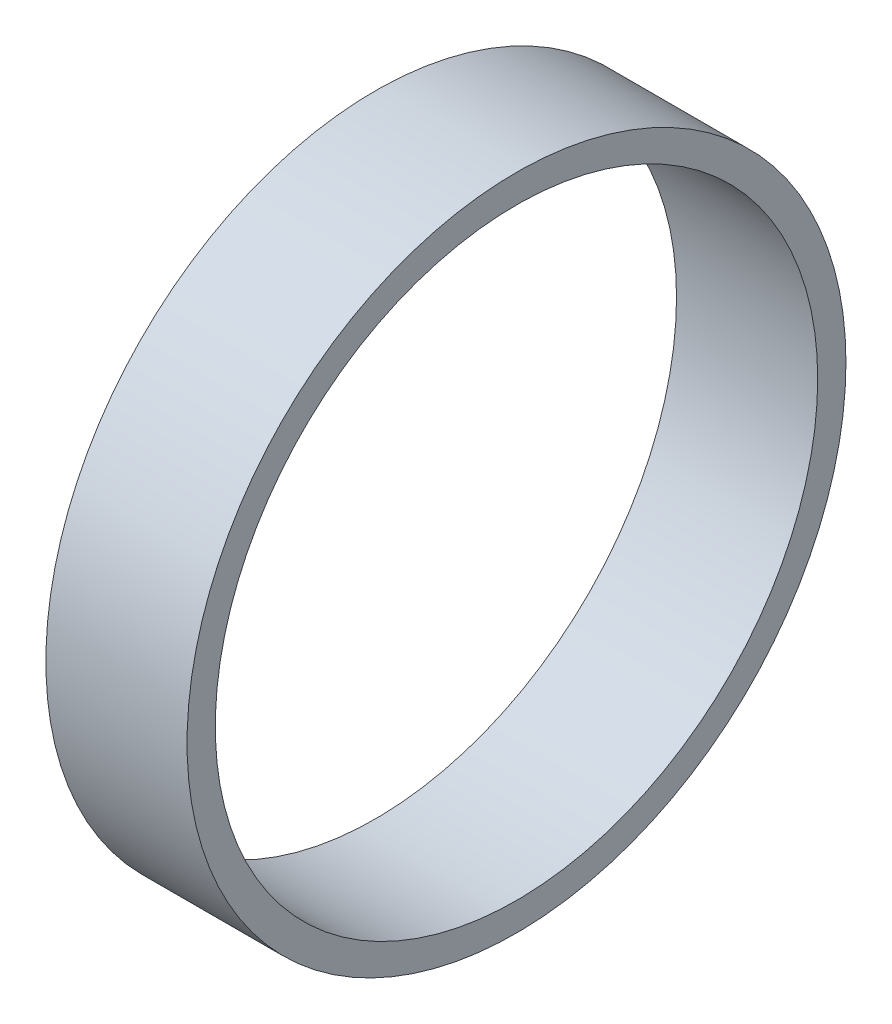
ISO-10303-21;
HEADER;
FILE_DESCRIPTION(('STEP AP214'),'2;1');
FILE_NAME('part.step','',(''),(''),'','','');
FILE_SCHEMA(('AUTOMOTIVE_DESIGN { 1 0 10303 214 1 1 1 1 }'));
ENDSEC;
DATA;
#1=APPLICATION_CONTEXT('core data for automotive mechanical design processes');
#2=APPLICATION_PROTOCOL_DEFINITION('international standard','automotive_design',2000,#1);
#3=PRODUCT_CONTEXT('',#1,'mechanical');
#4=PRODUCT('Part','Part','',(#3));
#5=PRODUCT_RELATED_PRODUCT_CATEGORY('part','',(#4));
#6=PRODUCT_DEFINITION_FORMATION('','',#4);
#7=PRODUCT_DEFINITION_CONTEXT('part definition',#1,'design');
#8=PRODUCT_DEFINITION('design','',#6,#7);
#9=PRODUCT_DEFINITION_SHAPE('','',#8);
#10=(LENGTH_UNIT() NAMED_UNIT(*) SI_UNIT(.MILLI.,.METRE.));
#11=(NAMED_UNIT(*) PLANE_ANGLE_UNIT() SI_UNIT($,.RADIAN.));
#12=(NAMED_UNIT(*) SI_UNIT($,.STERADIAN.) SOLID_ANGLE_UNIT());
#13=UNCERTAINTY_MEASURE_WITH_UNIT(LENGTH_MEASURE(1.E-05),#10,'distance_accuracy_value','');
#14=(GEOMETRIC_REPRESENTATION_CONTEXT(3) GLOBAL_UNCERTAINTY_ASSIGNED_CONTEXT((#13)) GLOBAL_UNIT_ASSIGNED_CONTEXT((#10,
#11,#12)) REPRESENTATION_CONTEXT('',''));
#15=CARTESIAN_POINT('',(0.,0.,0.));
#16=DIRECTION('',(0.,0.,1.));
#17=DIRECTION('',(1.,0.,0.));
#18=AXIS2_PLACEMENT_3D('',#15,#16,#17);
#19=CARTESIAN_POINT('',(15.,0.,0.));
#20=DIRECTION('',(1.,0.,0.));
#21=DIRECTION('',(0.,0.,-1.));
#22=AXIS2_PLACEMENT_3D('',#19,#20,#21);
#23=PLANE('',#22);
#24=CARTESIAN_POINT('',(15.,0.,0.));
#25=DIRECTION('',(1.,0.,0.));
#26=DIRECTION('',(0.,0.,-1.));
#27=AXIS2_PLACEMENT_3D('',#24,#25,#26);
#28=CIRCLE('',#27,35.);
#29=CARTESIAN_POINT('',(15.,0.,-35.));
#30=VERTEX_POINT('',#29);
#31=EDGE_CURVE('E10',#30,#30,#28,.T.);
#32=ORIENTED_EDGE('',*,*,#31,.T.);
#33=EDGE_LOOP('',(#32));
#34=FACE_BOUND('',#33,.T.);
#35=CARTESIAN_POINT('',(15.,0.,0.));
#36=DIRECTION('',(1.,0.,0.));
#37=DIRECTION('',(0.,0.,-1.));
#38=AXIS2_PLACEMENT_3D('',#35,#36,#37);
#39=CIRCLE('',#38,32.);
#40=CARTESIAN_POINT('',(15.,0.,-32.));
#41=VERTEX_POINT('',#40);
#42=EDGE_CURVE('E48',#41,#41,#39,.T.);
#43=ORIENTED_EDGE('',*,*,#42,.F.);
#44=EDGE_LOOP('',(#43));
#45=FACE_BOUND('',#44,.T.);
#46=ADVANCED_FACE('F37',(#34,#45),#23,.T.);
#47=CARTESIAN_POINT('',(0.,0.,0.));
#48=DIRECTION('',(1.,0.,0.));
#49=DIRECTION('',(0.,0.,-1.));
#50=AXIS2_PLACEMENT_3D('',#47,#48,#49);
#51=PLANE('',#50);
#52=CARTESIAN_POINT('',(0.,0.,0.));
#53=DIRECTION('',(1.,0.,0.));
#54=DIRECTION('',(0.,0.,-1.));
#55=AXIS2_PLACEMENT_3D('',#52,#53,#54);
#56=CIRCLE('',#55,35.);
#57=CARTESIAN_POINT('',(0.,0.,-35.));
#58=VERTEX_POINT('',#57);
#59=EDGE_CURVE('E41',#58,#58,#56,.T.);
#60=ORIENTED_EDGE('',*,*,#59,.F.);
#61=EDGE_LOOP('',(#60));
#62=FACE_BOUND('',#61,.T.);
#63=CARTESIAN_POINT('',(0.,0.,0.));
#64=DIRECTION('',(1.,0.,0.));
#65=DIRECTION('',(0.,0.,-1.));
#66=AXIS2_PLACEMENT_3D('',#63,#64,#65);
#67=CIRCLE('',#66,32.);
#68=CARTESIAN_POINT('',(0.,0.,-32.));
#69=VERTEX_POINT('',#68);
#70=EDGE_CURVE('E50',#69,#69,#67,.T.);
#71=ORIENTED_EDGE('',*,*,#70,.T.);
#72=EDGE_LOOP('',(#71));
#73=FACE_BOUND('',#72,.T.);
#74=ADVANCED_FACE('F60',(#62,#73),#51,.F.);
#75=CARTESIAN_POINT('',(15.,0.,0.));
#76=DIRECTION('',(-1.,0.,0.));
#77=DIRECTION('',(0.,0.,1.));
#78=AXIS2_PLACEMENT_3D('',#75,#76,#77);
#79=CYLINDRICAL_SURFACE('',#78,35.);
#80=ORIENTED_EDGE('',*,*,#31,.F.);
#81=EDGE_LOOP('',(#80));
#82=FACE_BOUND('',#81,.T.);
#83=ORIENTED_EDGE('',*,*,#59,.T.);
#84=EDGE_LOOP('',(#83));
#85=FACE_BOUND('',#84,.T.);
#86=ADVANCED_FACE('F39',(#82,#85),#79,.T.);
#87=CARTESIAN_POINT('',(15.,0.,0.));
#88=DIRECTION('',(-1.,0.,0.));
#89=DIRECTION('',(0.,0.,1.));
#90=AXIS2_PLACEMENT_3D('',#87,#88,#89);
#91=CYLINDRICAL_SURFACE('',#90,32.);
#92=ORIENTED_EDGE('',*,*,#42,.T.);
#93=EDGE_LOOP('',(#92));
#94=FACE_BOUND('',#93,.T.);
#95=ORIENTED_EDGE('',*,*,#70,.F.);
#96=EDGE_LOOP('',(#95));
#97=FACE_BOUND('',#96,.T.);
#98=ADVANCED_FACE('F56',(#94,#97),#91,.F.);
#99=CLOSED_SHELL('',(#46,#74,#86,#98));
#100=MANIFOLD_SOLID_BREP('B2',#99);
#101=ADVANCED_BREP_SHAPE_REPRESENTATION('',(#18,#100),#14);
#102=SHAPE_DEFINITION_REPRESENTATION(#9,#101);
ENDSEC;
END-ISO-10303-21;
